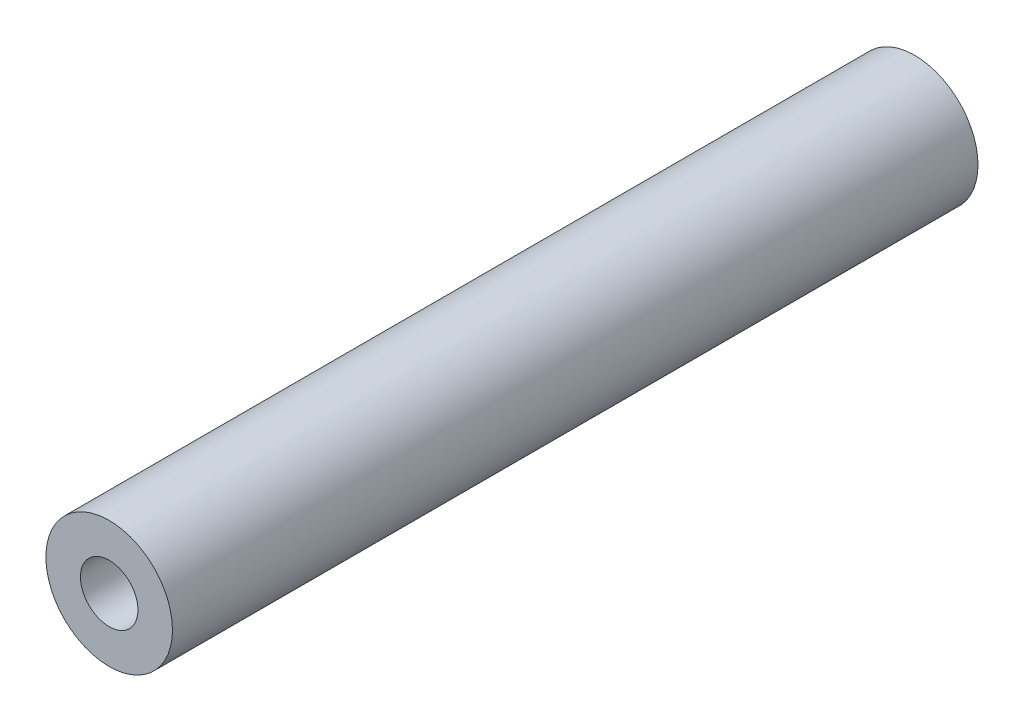
ISO-10303-21;
HEADER;
FILE_DESCRIPTION(('STEP AP214'),'2;1');
FILE_NAME('part.step','',(''),(''),'','','');
FILE_SCHEMA(('AUTOMOTIVE_DESIGN { 1 0 10303 214 1 1 1 1 }'));
ENDSEC;
DATA;
#1=APPLICATION_CONTEXT('core data for automotive mechanical design processes');
#2=APPLICATION_PROTOCOL_DEFINITION('international standard','automotive_design',2000,#1);
#3=PRODUCT_CONTEXT('',#1,'mechanical');
#4=PRODUCT('Part','Part','',(#3));
#5=PRODUCT_RELATED_PRODUCT_CATEGORY('part','',(#4));
#6=PRODUCT_DEFINITION_FORMATION('','',#4);
#7=PRODUCT_DEFINITION_CONTEXT('part definition',#1,'design');
#8=PRODUCT_DEFINITION('design','',#6,#7);
#9=PRODUCT_DEFINITION_SHAPE('','',#8);
#10=(LENGTH_UNIT() NAMED_UNIT(*) SI_UNIT(.MILLI.,.METRE.));
#11=(NAMED_UNIT(*) PLANE_ANGLE_UNIT() SI_UNIT($,.RADIAN.));
#12=(NAMED_UNIT(*) SI_UNIT($,.STERADIAN.) SOLID_ANGLE_UNIT());
#13=UNCERTAINTY_MEASURE_WITH_UNIT(LENGTH_MEASURE(1.E-05),#10,'distance_accuracy_value','');
#14=(GEOMETRIC_REPRESENTATION_CONTEXT(3) GLOBAL_UNCERTAINTY_ASSIGNED_CONTEXT((#13)) GLOBAL_UNIT_ASSIGNED_CONTEXT((#10,
#11,#12)) REPRESENTATION_CONTEXT('',''));
#15=CARTESIAN_POINT('',(0.,0.,0.));
#16=DIRECTION('',(0.,0.,1.));
#17=DIRECTION('',(1.,0.,0.));
#18=AXIS2_PLACEMENT_3D('',#15,#16,#17);
#19=CARTESIAN_POINT('',(0.,0.,35.));
#20=DIRECTION('',(0.,0.,-1.));
#21=DIRECTION('',(-1.,0.,0.));
#22=AXIS2_PLACEMENT_3D('',#19,#20,#21);
#23=CYLINDRICAL_SURFACE('',#22,2.75);
#24=CARTESIAN_POINT('',(0.,0.,35.));
#25=DIRECTION('',(0.,0.,1.));
#26=DIRECTION('',(1.,0.,0.));
#27=AXIS2_PLACEMENT_3D('',#24,#25,#26);
#28=CIRCLE('',#27,2.75);
#29=CARTESIAN_POINT('',(2.75,0.,35.));
#30=VERTEX_POINT('',#29);
#31=EDGE_CURVE('E10',#30,#30,#28,.T.);
#32=ORIENTED_EDGE('',*,*,#31,.F.);
#33=EDGE_LOOP('',(#32));
#34=FACE_BOUND('',#33,.T.);
#35=CARTESIAN_POINT('',(0.,0.,0.));
#36=DIRECTION('',(0.,0.,1.));
#37=DIRECTION('',(1.,0.,0.));
#38=AXIS2_PLACEMENT_3D('',#35,#36,#37);
#39=CIRCLE('',#38,2.75);
#40=CARTESIAN_POINT('',(2.75,0.,0.));
#41=VERTEX_POINT('',#40);
#42=EDGE_CURVE('E35',#41,#41,#39,.T.);
#43=ORIENTED_EDGE('',*,*,#42,.T.);
#44=EDGE_LOOP('',(#43));
#45=FACE_BOUND('',#44,.T.);
#46=ADVANCED_FACE('F32',(#34,#45),#23,.T.);
#47=CARTESIAN_POINT('',(0.,0.,35.));
#48=DIRECTION('',(0.,0.,1.));
#49=DIRECTION('',(1.,0.,0.));
#50=AXIS2_PLACEMENT_3D('',#47,#48,#49);
#51=PLANE('',#50);
#52=CARTESIAN_POINT('',(0.,0.,35.));
#53=DIRECTION('',(0.,0.,1.));
#54=DIRECTION('',(1.,0.,0.));
#55=AXIS2_PLACEMENT_3D('',#52,#53,#54);
#56=CIRCLE('',#55,1.25);
#57=CARTESIAN_POINT('',(1.25,0.,35.));
#58=VERTEX_POINT('',#57);
#59=EDGE_CURVE('E46',#58,#58,#56,.T.);
#60=ORIENTED_EDGE('',*,*,#59,.F.);
#61=EDGE_LOOP('',(#60));
#62=FACE_BOUND('',#61,.T.);
#63=ORIENTED_EDGE('',*,*,#31,.T.);
#64=EDGE_LOOP('',(#63));
#65=FACE_BOUND('',#64,.T.);
#66=ADVANCED_FACE('F53',(#62,#65),#51,.T.);
#67=CARTESIAN_POINT('',(0.,0.,0.));
#68=DIRECTION('',(0.,0.,1.));
#69=DIRECTION('',(1.,0.,0.));
#70=AXIS2_PLACEMENT_3D('',#67,#68,#69);
#71=PLANE('',#70);
#72=CARTESIAN_POINT('',(0.,0.,0.));
#73=DIRECTION('',(0.,0.,1.));
#74=DIRECTION('',(1.,0.,0.));
#75=AXIS2_PLACEMENT_3D('',#72,#73,#74);
#76=CIRCLE('',#75,1.25);
#77=CARTESIAN_POINT('',(1.25,0.,0.));
#78=VERTEX_POINT('',#77);
#79=EDGE_CURVE('E42',#78,#78,#76,.F.);
#80=ORIENTED_EDGE('',*,*,#79,.F.);
#81=EDGE_LOOP('',(#80));
#82=FACE_BOUND('',#81,.T.);
#83=ORIENTED_EDGE('',*,*,#42,.F.);
#84=EDGE_LOOP('',(#83));
#85=FACE_BOUND('',#84,.T.);
#86=ADVANCED_FACE('F55',(#82,#85),#71,.F.);
#87=CARTESIAN_POINT('',(0.,0.,-0.001000000000001));
#88=DIRECTION('',(0.,0.,1.));
#89=DIRECTION('',(1.,0.,0.));
#90=AXIS2_PLACEMENT_3D('',#87,#88,#89);
#91=CYLINDRICAL_SURFACE('',#90,1.25);
#92=ORIENTED_EDGE('',*,*,#59,.T.);
#93=EDGE_LOOP('',(#92));
#94=FACE_BOUND('',#93,.T.);
#95=ORIENTED_EDGE('',*,*,#79,.T.);
#96=EDGE_LOOP('',(#95));
#97=FACE_BOUND('',#96,.T.);
#98=ADVANCED_FACE('F50',(#94,#97),#91,.F.);
#99=CLOSED_SHELL('',(#46,#66,#86,#98));
#100=MANIFOLD_SOLID_BREP('B2',#99);
#101=ADVANCED_BREP_SHAPE_REPRESENTATION('',(#18,#100),#14);
#102=SHAPE_DEFINITION_REPRESENTATION(#9,#101);
ENDSEC;
END-ISO-10303-21;
